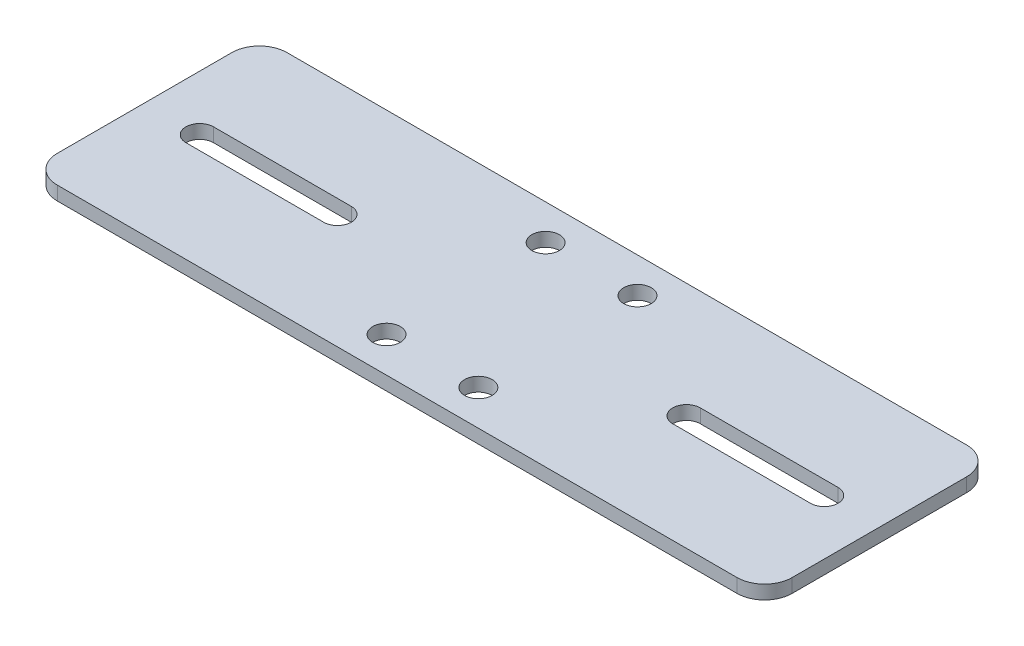
ISO-10303-21;
HEADER;
FILE_DESCRIPTION(('STEP AP214'),'2;1');
FILE_NAME('part.step','',(''),(''),'','','');
FILE_SCHEMA(('AUTOMOTIVE_DESIGN { 1 0 10303 214 1 1 1 1 }'));
ENDSEC;
DATA;
#1=APPLICATION_CONTEXT('core data for automotive mechanical design processes');
#2=APPLICATION_PROTOCOL_DEFINITION('international standard','automotive_design',2000,#1);
#3=PRODUCT_CONTEXT('',#1,'mechanical');
#4=PRODUCT('Part','Part','',(#3));
#5=PRODUCT_RELATED_PRODUCT_CATEGORY('part','',(#4));
#6=PRODUCT_DEFINITION_FORMATION('','',#4);
#7=PRODUCT_DEFINITION_CONTEXT('part definition',#1,'design');
#8=PRODUCT_DEFINITION('design','',#6,#7);
#9=PRODUCT_DEFINITION_SHAPE('','',#8);
#10=(LENGTH_UNIT() NAMED_UNIT(*) SI_UNIT(.MILLI.,.METRE.));
#11=(NAMED_UNIT(*) PLANE_ANGLE_UNIT() SI_UNIT($,.RADIAN.));
#12=(NAMED_UNIT(*) SI_UNIT($,.STERADIAN.) SOLID_ANGLE_UNIT());
#13=UNCERTAINTY_MEASURE_WITH_UNIT(LENGTH_MEASURE(1.E-05),#10,'distance_accuracy_value','');
#14=(GEOMETRIC_REPRESENTATION_CONTEXT(3) GLOBAL_UNCERTAINTY_ASSIGNED_CONTEXT((#13)) GLOBAL_UNIT_ASSIGNED_CONTEXT((#10,
#11,#12)) REPRESENTATION_CONTEXT('',''));
#15=CARTESIAN_POINT('',(0.,0.,0.));
#16=DIRECTION('',(0.,0.,1.));
#17=DIRECTION('',(1.,0.,0.));
#18=AXIS2_PLACEMENT_3D('',#15,#16,#17);
#19=CARTESIAN_POINT('',(40.0000000000001,-1.5,12.5));
#20=DIRECTION('',(1.,0.,0.));
#21=DIRECTION('',(0.,0.,-1.));
#22=AXIS2_PLACEMENT_3D('',#19,#20,#21);
#23=PLANE('',#22);
#24=DIRECTION('',(0.,0.,-1.));
#25=VECTOR('',#24,1.);
#26=CARTESIAN_POINT('',(40.0000000000001,0.,12.5));
#27=LINE('',#26,#25);
#28=CARTESIAN_POINT('',(40.0000000000001,0.,9.50000000000003));
#29=VERTEX_POINT('',#28);
#30=CARTESIAN_POINT('',(40.0000000000001,0.,-9.50000000000002));
#31=VERTEX_POINT('',#30);
#32=EDGE_CURVE('E223',#29,#31,#27,.T.);
#33=ORIENTED_EDGE('',*,*,#32,.F.);
#34=DIRECTION('',(0.,1.,0.));
#35=VECTOR('',#34,1.);
#36=CARTESIAN_POINT('',(40.0000000000001,-1.5,9.50000000000003));
#37=LINE('',#36,#35);
#38=CARTESIAN_POINT('',(40.0000000000001,-1.5,9.50000000000003));
#39=VERTEX_POINT('',#38);
#40=EDGE_CURVE('E268',#29,#39,#37,.F.);
#41=ORIENTED_EDGE('',*,*,#40,.T.);
#42=DIRECTION('',(0.,0.,-1.));
#43=VECTOR('',#42,1.);
#44=CARTESIAN_POINT('',(40.0000000000001,-1.5,12.5));
#45=LINE('',#44,#43);
#46=CARTESIAN_POINT('',(40.0000000000001,-1.5,-9.50000000000002));
#47=VERTEX_POINT('',#46);
#48=EDGE_CURVE('E230',#39,#47,#45,.T.);
#49=ORIENTED_EDGE('',*,*,#48,.T.);
#50=DIRECTION('',(0.,1.,0.));
#51=VECTOR('',#50,1.);
#52=CARTESIAN_POINT('',(40.0000000000001,-1.5,-9.50000000000002));
#53=LINE('',#52,#51);
#54=EDGE_CURVE('E265',#47,#31,#53,.T.);
#55=ORIENTED_EDGE('',*,*,#54,.T.);
#56=EDGE_LOOP('',(#33,#41,#49,#55));
#57=FACE_BOUND('',#56,.T.);
#58=ADVANCED_FACE('F36',(#57),#23,.T.);
#59=CARTESIAN_POINT('',(-40.0000000000001,-1.5,12.5));
#60=DIRECTION('',(0.,0.,1.));
#61=DIRECTION('',(1.,0.,0.));
#62=AXIS2_PLACEMENT_3D('',#59,#60,#61);
#63=PLANE('',#62);
#64=DIRECTION('',(1.,0.,0.));
#65=VECTOR('',#64,1.);
#66=CARTESIAN_POINT('',(-40.0000000000001,-1.5,12.5));
#67=LINE('',#66,#65);
#68=CARTESIAN_POINT('',(-37.0000000000001,-1.5,12.5));
#69=VERTEX_POINT('',#68);
#70=CARTESIAN_POINT('',(37.0000000000001,-1.5,12.5));
#71=VERTEX_POINT('',#70);
#72=EDGE_CURVE('E239',#69,#71,#67,.T.);
#73=ORIENTED_EDGE('',*,*,#72,.T.);
#74=DIRECTION('',(0.,1.,0.));
#75=VECTOR('',#74,1.);
#76=CARTESIAN_POINT('',(37.0000000000001,-1.5,12.5));
#77=LINE('',#76,#75);
#78=CARTESIAN_POINT('',(37.0000000000001,0.,12.5));
#79=VERTEX_POINT('',#78);
#80=EDGE_CURVE('E254',#71,#79,#77,.T.);
#81=ORIENTED_EDGE('',*,*,#80,.T.);
#82=DIRECTION('',(1.,0.,0.));
#83=VECTOR('',#82,1.);
#84=CARTESIAN_POINT('',(-40.0000000000001,0.,12.5));
#85=LINE('',#84,#83);
#86=CARTESIAN_POINT('',(-37.0000000000001,0.,12.5));
#87=VERTEX_POINT('',#86);
#88=EDGE_CURVE('E234',#87,#79,#85,.T.);
#89=ORIENTED_EDGE('',*,*,#88,.F.);
#90=DIRECTION('',(0.,1.,0.));
#91=VECTOR('',#90,1.);
#92=CARTESIAN_POINT('',(-37.0000000000001,-1.5,12.5));
#93=LINE('',#92,#91);
#94=EDGE_CURVE('E242',#87,#69,#93,.F.);
#95=ORIENTED_EDGE('',*,*,#94,.T.);
#96=EDGE_LOOP('',(#73,#81,#89,#95));
#97=FACE_BOUND('',#96,.T.);
#98=ADVANCED_FACE('F308',(#97),#63,.T.);
#99=CARTESIAN_POINT('',(-40.0000000000001,-1.5,12.5));
#100=DIRECTION('',(-1.,0.,0.));
#101=DIRECTION('',(0.,0.,1.));
#102=AXIS2_PLACEMENT_3D('',#99,#100,#101);
#103=PLANE('',#102);
#104=DIRECTION('',(0.,0.,1.));
#105=VECTOR('',#104,1.);
#106=CARTESIAN_POINT('',(-40.0000000000001,0.,12.5));
#107=LINE('',#106,#105);
#108=CARTESIAN_POINT('',(-40.0000000000001,0.,-9.50000000000002));
#109=VERTEX_POINT('',#108);
#110=CARTESIAN_POINT('',(-40.0000000000001,0.,9.50000000000003));
#111=VERTEX_POINT('',#110);
#112=EDGE_CURVE('E248',#109,#111,#107,.T.);
#113=ORIENTED_EDGE('',*,*,#112,.F.);
#114=DIRECTION('',(0.,1.,0.));
#115=VECTOR('',#114,1.);
#116=CARTESIAN_POINT('',(-40.0000000000001,-1.5,-9.50000000000002));
#117=LINE('',#116,#115);
#118=CARTESIAN_POINT('',(-40.0000000000001,-1.5,-9.50000000000002));
#119=VERTEX_POINT('',#118);
#120=EDGE_CURVE('E11',#109,#119,#117,.F.);
#121=ORIENTED_EDGE('',*,*,#120,.T.);
#122=DIRECTION('',(0.,0.,1.));
#123=VECTOR('',#122,1.);
#124=CARTESIAN_POINT('',(-40.0000000000001,-1.5,12.5));
#125=LINE('',#124,#123);
#126=CARTESIAN_POINT('',(-40.0000000000001,-1.5,9.50000000000003));
#127=VERTEX_POINT('',#126);
#128=EDGE_CURVE('E236',#119,#127,#125,.T.);
#129=ORIENTED_EDGE('',*,*,#128,.T.);
#130=DIRECTION('',(0.,1.,0.));
#131=VECTOR('',#130,1.);
#132=CARTESIAN_POINT('',(-40.0000000000001,-1.5,9.50000000000003));
#133=LINE('',#132,#131);
#134=EDGE_CURVE('E44',#127,#111,#133,.T.);
#135=ORIENTED_EDGE('',*,*,#134,.T.);
#136=EDGE_LOOP('',(#113,#121,#129,#135));
#137=FACE_BOUND('',#136,.T.);
#138=ADVANCED_FACE('F284',(#137),#103,.T.);
#139=CARTESIAN_POINT('',(-40.0000000000001,-1.5,-12.5));
#140=DIRECTION('',(0.,0.,-1.));
#141=DIRECTION('',(-1.,0.,0.));
#142=AXIS2_PLACEMENT_3D('',#139,#140,#141);
#143=PLANE('',#142);
#144=DIRECTION('',(-1.,0.,0.));
#145=VECTOR('',#144,1.);
#146=CARTESIAN_POINT('',(-40.0000000000001,0.,-12.5));
#147=LINE('',#146,#145);
#148=CARTESIAN_POINT('',(37.0000000000001,0.,-12.5));
#149=VERTEX_POINT('',#148);
#150=CARTESIAN_POINT('',(-37.0000000000001,0.,-12.5));
#151=VERTEX_POINT('',#150);
#152=EDGE_CURVE('E245',#149,#151,#147,.T.);
#153=ORIENTED_EDGE('',*,*,#152,.F.);
#154=DIRECTION('',(0.,1.,0.));
#155=VECTOR('',#154,1.);
#156=CARTESIAN_POINT('',(37.0000000000001,-1.5,-12.5));
#157=LINE('',#156,#155);
#158=CARTESIAN_POINT('',(37.0000000000001,-1.5,-12.5));
#159=VERTEX_POINT('',#158);
#160=EDGE_CURVE('E58',#149,#159,#157,.F.);
#161=ORIENTED_EDGE('',*,*,#160,.T.);
#162=DIRECTION('',(-1.,0.,0.));
#163=VECTOR('',#162,1.);
#164=CARTESIAN_POINT('',(-40.0000000000001,-1.5,-12.5));
#165=LINE('',#164,#163);
#166=CARTESIAN_POINT('',(-37.0000000000001,-1.5,-12.5));
#167=VERTEX_POINT('',#166);
#168=EDGE_CURVE('E233',#159,#167,#165,.T.);
#169=ORIENTED_EDGE('',*,*,#168,.T.);
#170=DIRECTION('',(0.,1.,0.));
#171=VECTOR('',#170,1.);
#172=CARTESIAN_POINT('',(-37.0000000000001,-1.5,-12.5));
#173=LINE('',#172,#171);
#174=EDGE_CURVE('E277',#167,#151,#173,.T.);
#175=ORIENTED_EDGE('',*,*,#174,.T.);
#176=EDGE_LOOP('',(#153,#161,#169,#175));
#177=FACE_BOUND('',#176,.T.);
#178=ADVANCED_FACE('F294',(#177),#143,.T.);
#179=CARTESIAN_POINT('',(0.,-1.5,0.));
#180=DIRECTION('',(0.,-1.,0.));
#181=DIRECTION('',(0.,0.,-1.));
#182=AXIS2_PLACEMENT_3D('',#179,#180,#181);
#183=PLANE('',#182);
#184=CARTESIAN_POINT('',(5.0000000000001,-1.5,-8.66025403784435));
#185=DIRECTION('',(0.,1.,0.));
#186=DIRECTION('',(0.,0.,1.));
#187=AXIS2_PLACEMENT_3D('',#184,#185,#186);
#188=CIRCLE('',#187,1.5);
#189=CARTESIAN_POINT('',(5.0000000000001,-1.5,-7.16025403784435));
#190=VERTEX_POINT('',#189);
#191=EDGE_CURVE('E466',#190,#190,#188,.T.);
#192=ORIENTED_EDGE('',*,*,#191,.T.);
#193=EDGE_LOOP('',(#192));
#194=FACE_BOUND('',#193,.T.);
#195=CARTESIAN_POINT('',(-4.99999999999991,-1.5,-8.66025403784446));
#196=DIRECTION('',(0.,1.,0.));
#197=DIRECTION('',(0.,0.,1.));
#198=AXIS2_PLACEMENT_3D('',#195,#196,#197);
#199=CIRCLE('',#198,1.5);
#200=CARTESIAN_POINT('',(-4.99999999999991,-1.5,-7.16025403784445));
#201=VERTEX_POINT('',#200);
#202=EDGE_CURVE('E470',#201,#201,#199,.T.);
#203=ORIENTED_EDGE('',*,*,#202,.T.);
#204=EDGE_LOOP('',(#203));
#205=FACE_BOUND('',#204,.T.);
#206=CARTESIAN_POINT('',(-5.00000000000005,-1.5,8.66025403784439));
#207=DIRECTION('',(0.,1.,0.));
#208=DIRECTION('',(0.,0.,1.));
#209=AXIS2_PLACEMENT_3D('',#206,#207,#208);
#210=CIRCLE('',#209,1.5);
#211=CARTESIAN_POINT('',(-5.00000000000005,-1.5,10.1602540378444));
#212=VERTEX_POINT('',#211);
#213=EDGE_CURVE('E474',#212,#212,#210,.T.);
#214=ORIENTED_EDGE('',*,*,#213,.T.);
#215=EDGE_LOOP('',(#214));
#216=FACE_BOUND('',#215,.T.);
#217=CARTESIAN_POINT('',(5.00000000000002,-1.5,8.66025403784442));
#218=DIRECTION('',(0.,1.,0.));
#219=DIRECTION('',(0.,0.,1.));
#220=AXIS2_PLACEMENT_3D('',#217,#218,#219);
#221=CIRCLE('',#220,1.5);
#222=CARTESIAN_POINT('',(5.00000000000002,-1.5,10.1602540378444));
#223=VERTEX_POINT('',#222);
#224=EDGE_CURVE('E188',#223,#223,#221,.T.);
#225=ORIENTED_EDGE('',*,*,#224,.T.);
#226=EDGE_LOOP('',(#225));
#227=FACE_BOUND('',#226,.T.);
#228=CARTESIAN_POINT('',(-34.0000000000001,-1.5,0.));
#229=DIRECTION('',(0.,1.,0.));
#230=DIRECTION('',(0.,0.,-1.));
#231=AXIS2_PLACEMENT_3D('',#228,#229,#230);
#232=CIRCLE('',#231,1.50000000000001);
#233=CARTESIAN_POINT('',(-34.0000000000001,-1.5,-1.50000000000001));
#234=VERTEX_POINT('',#233);
#235=CARTESIAN_POINT('',(-34.0000000000001,-1.5,1.50000000000001));
#236=VERTEX_POINT('',#235);
#237=EDGE_CURVE('E154',#234,#236,#232,.T.);
#238=ORIENTED_EDGE('',*,*,#237,.T.);
#239=DIRECTION('',(1.,0.,0.));
#240=VECTOR('',#239,1.);
#241=CARTESIAN_POINT('',(-34.0000000000001,-1.5,1.50000000000001));
#242=LINE('',#241,#240);
#243=CARTESIAN_POINT('',(-19.,-1.5,1.50000000000001));
#244=VERTEX_POINT('',#243);
#245=EDGE_CURVE('E166',#236,#244,#242,.T.);
#246=ORIENTED_EDGE('',*,*,#245,.T.);
#247=CARTESIAN_POINT('',(-19.0000000000001,-1.5,0.));
#248=DIRECTION('',(0.,1.,0.));
#249=DIRECTION('',(0.,0.,-1.));
#250=AXIS2_PLACEMENT_3D('',#247,#248,#249);
#251=CIRCLE('',#250,1.50000000000001);
#252=CARTESIAN_POINT('',(-19.0000000000001,-1.5,-1.5));
#253=VERTEX_POINT('',#252);
#254=EDGE_CURVE('E170',#244,#253,#251,.T.);
#255=ORIENTED_EDGE('',*,*,#254,.T.);
#256=DIRECTION('',(-1.,0.,0.));
#257=VECTOR('',#256,1.);
#258=CARTESIAN_POINT('',(-34.0000000000001,-1.5,-1.50000000000001));
#259=LINE('',#258,#257);
#260=EDGE_CURVE('E162',#253,#234,#259,.T.);
#261=ORIENTED_EDGE('',*,*,#260,.T.);
#262=EDGE_LOOP('',(#238,#246,#255,#261));
#263=FACE_BOUND('',#262,.T.);
#264=CARTESIAN_POINT('',(34.0000000000001,-1.5,0.));
#265=DIRECTION('',(0.,1.,0.));
#266=DIRECTION('',(0.,0.,1.));
#267=AXIS2_PLACEMENT_3D('',#264,#265,#266);
#268=CIRCLE('',#267,1.50000000000001);
#269=CARTESIAN_POINT('',(34.0000000000001,-1.5,1.50000000000001));
#270=VERTEX_POINT('',#269);
#271=CARTESIAN_POINT('',(34.0000000000001,-1.5,-1.50000000000001));
#272=VERTEX_POINT('',#271);
#273=EDGE_CURVE('E198',#270,#272,#268,.T.);
#274=ORIENTED_EDGE('',*,*,#273,.T.);
#275=DIRECTION('',(-1.,0.,0.));
#276=VECTOR('',#275,1.);
#277=CARTESIAN_POINT('',(34.0000000000001,-1.5,-1.50000000000001));
#278=LINE('',#277,#276);
#279=CARTESIAN_POINT('',(19.0000000000001,-1.5,-1.50000000000001));
#280=VERTEX_POINT('',#279);
#281=EDGE_CURVE('E201',#272,#280,#278,.T.);
#282=ORIENTED_EDGE('',*,*,#281,.T.);
#283=CARTESIAN_POINT('',(19.0000000000001,-1.5,0.));
#284=DIRECTION('',(0.,1.,0.));
#285=DIRECTION('',(0.,0.,1.));
#286=AXIS2_PLACEMENT_3D('',#283,#284,#285);
#287=CIRCLE('',#286,1.50000000000001);
#288=CARTESIAN_POINT('',(19.0000000000001,-1.5,1.5));
#289=VERTEX_POINT('',#288);
#290=EDGE_CURVE('E205',#280,#289,#287,.T.);
#291=ORIENTED_EDGE('',*,*,#290,.T.);
#292=DIRECTION('',(1.,0.,0.));
#293=VECTOR('',#292,1.);
#294=CARTESIAN_POINT('',(34.0000000000001,-1.5,1.50000000000001));
#295=LINE('',#294,#293);
#296=EDGE_CURVE('E208',#289,#270,#295,.T.);
#297=ORIENTED_EDGE('',*,*,#296,.T.);
#298=EDGE_LOOP('',(#274,#282,#291,#297));
#299=FACE_BOUND('',#298,.T.);
#300=ORIENTED_EDGE('',*,*,#48,.F.);
#301=CARTESIAN_POINT('',(37.0000000000001,-1.5,9.50000000000003));
#302=DIRECTION('',(0.,-1.,0.));
#303=DIRECTION('',(0.,0.,-1.));
#304=AXIS2_PLACEMENT_3D('',#301,#302,#303);
#305=CIRCLE('',#304,3.);
#306=EDGE_CURVE('E275',#39,#71,#305,.T.);
#307=ORIENTED_EDGE('',*,*,#306,.T.);
#308=ORIENTED_EDGE('',*,*,#72,.F.);
#309=CARTESIAN_POINT('',(-37.0000000000001,-1.5,9.50000000000003));
#310=DIRECTION('',(0.,-1.,0.));
#311=DIRECTION('',(0.,0.,-1.));
#312=AXIS2_PLACEMENT_3D('',#309,#310,#311);
#313=CIRCLE('',#312,3.);
#314=EDGE_CURVE('E270',#69,#127,#313,.T.);
#315=ORIENTED_EDGE('',*,*,#314,.T.);
#316=ORIENTED_EDGE('',*,*,#128,.F.);
#317=CARTESIAN_POINT('',(-37.0000000000001,-1.5,-9.50000000000002));
#318=DIRECTION('',(0.,-1.,0.));
#319=DIRECTION('',(0.,0.,-1.));
#320=AXIS2_PLACEMENT_3D('',#317,#318,#319);
#321=CIRCLE('',#320,3.);
#322=EDGE_CURVE('E51',#119,#167,#321,.T.);
#323=ORIENTED_EDGE('',*,*,#322,.T.);
#324=ORIENTED_EDGE('',*,*,#168,.F.);
#325=CARTESIAN_POINT('',(37.0000000000001,-1.5,-9.50000000000002));
#326=DIRECTION('',(0.,-1.,0.));
#327=DIRECTION('',(0.,0.,-1.));
#328=AXIS2_PLACEMENT_3D('',#325,#326,#327);
#329=CIRCLE('',#328,3.);
#330=EDGE_CURVE('E273',#159,#47,#329,.T.);
#331=ORIENTED_EDGE('',*,*,#330,.T.);
#332=EDGE_LOOP('',(#300,#307,#308,#315,#316,#323,#324,#331));
#333=FACE_BOUND('',#332,.T.);
#334=ADVANCED_FACE('F172',(#194,#205,#216,#227,#263,#299,#333),#183,.T.);
#335=CARTESIAN_POINT('',(0.,0.,0.));
#336=DIRECTION('',(0.,-1.,0.));
#337=DIRECTION('',(0.,0.,-1.));
#338=AXIS2_PLACEMENT_3D('',#335,#336,#337);
#339=PLANE('',#338);
#340=CARTESIAN_POINT('',(5.0000000000001,0.,-8.66025403784435));
#341=DIRECTION('',(0.,1.,0.));
#342=DIRECTION('',(0.,0.,1.));
#343=AXIS2_PLACEMENT_3D('',#340,#341,#342);
#344=CIRCLE('',#343,1.5);
#345=CARTESIAN_POINT('',(5.0000000000001,0.,-7.16025403784435));
#346=VERTEX_POINT('',#345);
#347=EDGE_CURVE('E487',#346,#346,#344,.T.);
#348=ORIENTED_EDGE('',*,*,#347,.F.);
#349=EDGE_LOOP('',(#348));
#350=FACE_BOUND('',#349,.T.);
#351=CARTESIAN_POINT('',(-4.99999999999991,0.,-8.66025403784446));
#352=DIRECTION('',(0.,1.,0.));
#353=DIRECTION('',(0.,0.,1.));
#354=AXIS2_PLACEMENT_3D('',#351,#352,#353);
#355=CIRCLE('',#354,1.5);
#356=CARTESIAN_POINT('',(-4.99999999999991,0.,-7.16025403784445));
#357=VERTEX_POINT('',#356);
#358=EDGE_CURVE('E483',#357,#357,#355,.T.);
#359=ORIENTED_EDGE('',*,*,#358,.F.);
#360=EDGE_LOOP('',(#359));
#361=FACE_BOUND('',#360,.T.);
#362=CARTESIAN_POINT('',(-5.00000000000005,0.,8.66025403784439));
#363=DIRECTION('',(0.,1.,0.));
#364=DIRECTION('',(0.,0.,1.));
#365=AXIS2_PLACEMENT_3D('',#362,#363,#364);
#366=CIRCLE('',#365,1.5);
#367=CARTESIAN_POINT('',(-5.00000000000005,0.,10.1602540378444));
#368=VERTEX_POINT('',#367);
#369=EDGE_CURVE('E479',#368,#368,#366,.T.);
#370=ORIENTED_EDGE('',*,*,#369,.F.);
#371=EDGE_LOOP('',(#370));
#372=FACE_BOUND('',#371,.T.);
#373=CARTESIAN_POINT('',(5.00000000000002,0.,8.66025403784442));
#374=DIRECTION('',(0.,1.,0.));
#375=DIRECTION('',(0.,0.,1.));
#376=AXIS2_PLACEMENT_3D('',#373,#374,#375);
#377=CIRCLE('',#376,1.5);
#378=CARTESIAN_POINT('',(5.00000000000002,0.,10.1602540378444));
#379=VERTEX_POINT('',#378);
#380=EDGE_CURVE('E181',#379,#379,#377,.T.);
#381=ORIENTED_EDGE('',*,*,#380,.F.);
#382=EDGE_LOOP('',(#381));
#383=FACE_BOUND('',#382,.T.);
#384=DIRECTION('',(1.,0.,0.));
#385=VECTOR('',#384,1.);
#386=CARTESIAN_POINT('',(-34.0000000000001,0.,1.50000000000001));
#387=LINE('',#386,#385);
#388=CARTESIAN_POINT('',(-34.0000000000001,0.,1.50000000000001));
#389=VERTEX_POINT('',#388);
#390=CARTESIAN_POINT('',(-19.,0.,1.50000000000001));
#391=VERTEX_POINT('',#390);
#392=EDGE_CURVE('E187',#389,#391,#387,.T.);
#393=ORIENTED_EDGE('',*,*,#392,.F.);
#394=CARTESIAN_POINT('',(-34.0000000000001,0.,0.));
#395=DIRECTION('',(0.,1.,0.));
#396=DIRECTION('',(0.,0.,-1.));
#397=AXIS2_PLACEMENT_3D('',#394,#395,#396);
#398=CIRCLE('',#397,1.50000000000001);
#399=CARTESIAN_POINT('',(-34.0000000000001,0.,-1.50000000000001));
#400=VERTEX_POINT('',#399);
#401=EDGE_CURVE('E157',#400,#389,#398,.T.);
#402=ORIENTED_EDGE('',*,*,#401,.F.);
#403=DIRECTION('',(-1.,0.,0.));
#404=VECTOR('',#403,1.);
#405=CARTESIAN_POINT('',(-34.0000000000001,0.,-1.50000000000001));
#406=LINE('',#405,#404);
#407=CARTESIAN_POINT('',(-19.0000000000001,0.,-1.5));
#408=VERTEX_POINT('',#407);
#409=EDGE_CURVE('E175',#408,#400,#406,.T.);
#410=ORIENTED_EDGE('',*,*,#409,.F.);
#411=CARTESIAN_POINT('',(-19.0000000000001,0.,0.));
#412=DIRECTION('',(0.,1.,0.));
#413=DIRECTION('',(0.,0.,-1.));
#414=AXIS2_PLACEMENT_3D('',#411,#412,#413);
#415=CIRCLE('',#414,1.50000000000001);
#416=EDGE_CURVE('E178',#391,#408,#415,.T.);
#417=ORIENTED_EDGE('',*,*,#416,.F.);
#418=EDGE_LOOP('',(#393,#402,#410,#417));
#419=FACE_BOUND('',#418,.T.);
#420=DIRECTION('',(-1.,0.,0.));
#421=VECTOR('',#420,1.);
#422=CARTESIAN_POINT('',(34.0000000000001,0.,-1.50000000000001));
#423=LINE('',#422,#421);
#424=CARTESIAN_POINT('',(34.0000000000001,0.,-1.50000000000001));
#425=VERTEX_POINT('',#424);
#426=CARTESIAN_POINT('',(19.0000000000001,0.,-1.50000000000001));
#427=VERTEX_POINT('',#426);
#428=EDGE_CURVE('E213',#425,#427,#423,.T.);
#429=ORIENTED_EDGE('',*,*,#428,.F.);
#430=CARTESIAN_POINT('',(34.0000000000001,0.,0.));
#431=DIRECTION('',(0.,1.,0.));
#432=DIRECTION('',(0.,0.,1.));
#433=AXIS2_PLACEMENT_3D('',#430,#431,#432);
#434=CIRCLE('',#433,1.50000000000001);
#435=CARTESIAN_POINT('',(34.0000000000001,0.,1.50000000000001));
#436=VERTEX_POINT('',#435);
#437=EDGE_CURVE('E194',#436,#425,#434,.T.);
#438=ORIENTED_EDGE('',*,*,#437,.F.);
#439=DIRECTION('',(1.,0.,0.));
#440=VECTOR('',#439,1.);
#441=CARTESIAN_POINT('',(34.0000000000001,0.,1.50000000000001));
#442=LINE('',#441,#440);
#443=CARTESIAN_POINT('',(19.0000000000001,0.,1.5));
#444=VERTEX_POINT('',#443);
#445=EDGE_CURVE('E202',#444,#436,#442,.T.);
#446=ORIENTED_EDGE('',*,*,#445,.F.);
#447=CARTESIAN_POINT('',(19.0000000000001,0.,0.));
#448=DIRECTION('',(0.,1.,0.));
#449=DIRECTION('',(0.,0.,1.));
#450=AXIS2_PLACEMENT_3D('',#447,#448,#449);
#451=CIRCLE('',#450,1.50000000000001);
#452=EDGE_CURVE('E216',#427,#444,#451,.T.);
#453=ORIENTED_EDGE('',*,*,#452,.F.);
#454=EDGE_LOOP('',(#429,#438,#446,#453));
#455=FACE_BOUND('',#454,.T.);
#456=ORIENTED_EDGE('',*,*,#88,.T.);
#457=CARTESIAN_POINT('',(37.0000000000001,0.,9.50000000000003));
#458=DIRECTION('',(0.,-1.,0.));
#459=DIRECTION('',(0.,0.,-1.));
#460=AXIS2_PLACEMENT_3D('',#457,#458,#459);
#461=CIRCLE('',#460,3.);
#462=EDGE_CURVE('E263',#79,#29,#461,.F.);
#463=ORIENTED_EDGE('',*,*,#462,.T.);
#464=ORIENTED_EDGE('',*,*,#32,.T.);
#465=CARTESIAN_POINT('',(37.0000000000001,0.,-9.50000000000002));
#466=DIRECTION('',(0.,-1.,0.));
#467=DIRECTION('',(0.,0.,-1.));
#468=AXIS2_PLACEMENT_3D('',#465,#466,#467);
#469=CIRCLE('',#468,3.);
#470=EDGE_CURVE('E261',#31,#149,#469,.F.);
#471=ORIENTED_EDGE('',*,*,#470,.T.);
#472=ORIENTED_EDGE('',*,*,#152,.T.);
#473=CARTESIAN_POINT('',(-37.0000000000001,0.,-9.50000000000002));
#474=DIRECTION('',(0.,-1.,0.));
#475=DIRECTION('',(0.,0.,-1.));
#476=AXIS2_PLACEMENT_3D('',#473,#474,#475);
#477=CIRCLE('',#476,3.);
#478=EDGE_CURVE('E259',#151,#109,#477,.F.);
#479=ORIENTED_EDGE('',*,*,#478,.T.);
#480=ORIENTED_EDGE('',*,*,#112,.T.);
#481=CARTESIAN_POINT('',(-37.0000000000001,0.,9.50000000000003));
#482=DIRECTION('',(0.,-1.,0.));
#483=DIRECTION('',(0.,0.,-1.));
#484=AXIS2_PLACEMENT_3D('',#481,#482,#483);
#485=CIRCLE('',#484,3.);
#486=EDGE_CURVE('E257',#111,#87,#485,.F.);
#487=ORIENTED_EDGE('',*,*,#486,.T.);
#488=EDGE_LOOP('',(#456,#463,#464,#471,#472,#479,#480,#487));
#489=FACE_BOUND('',#488,.T.);
#490=ADVANCED_FACE('F289',(#350,#361,#372,#383,#419,#455,#489),#339,.F.);
#491=CARTESIAN_POINT('',(34.0000000000001,-1.5,0.));
#492=DIRECTION('',(0.,1.,0.));
#493=DIRECTION('',(0.,0.,1.));
#494=AXIS2_PLACEMENT_3D('',#491,#492,#493);
#495=CYLINDRICAL_SURFACE('',#494,1.50000000000001);
#496=ORIENTED_EDGE('',*,*,#437,.T.);
#497=DIRECTION('',(0.,1.,0.));
#498=VECTOR('',#497,1.);
#499=CARTESIAN_POINT('',(34.0000000000001,-1.5,-1.50000000000001));
#500=LINE('',#499,#498);
#501=EDGE_CURVE('E211',#272,#425,#500,.T.);
#502=ORIENTED_EDGE('',*,*,#501,.F.);
#503=ORIENTED_EDGE('',*,*,#273,.F.);
#504=DIRECTION('',(0.,1.,0.));
#505=VECTOR('',#504,1.);
#506=CARTESIAN_POINT('',(34.0000000000001,-1.5,1.50000000000001));
#507=LINE('',#506,#505);
#508=EDGE_CURVE('E221',#270,#436,#507,.T.);
#509=ORIENTED_EDGE('',*,*,#508,.T.);
#510=EDGE_LOOP('',(#496,#502,#503,#509));
#511=FACE_BOUND('',#510,.T.);
#512=ADVANCED_FACE('F422',(#511),#495,.F.);
#513=CARTESIAN_POINT('',(34.0000000000001,-1.5,1.50000000000001));
#514=DIRECTION('',(0.,0.,1.));
#515=DIRECTION('',(1.,0.,0.));
#516=AXIS2_PLACEMENT_3D('',#513,#514,#515);
#517=PLANE('',#516);
#518=ORIENTED_EDGE('',*,*,#445,.T.);
#519=ORIENTED_EDGE('',*,*,#508,.F.);
#520=ORIENTED_EDGE('',*,*,#296,.F.);
#521=DIRECTION('',(0.,1.,0.));
#522=VECTOR('',#521,1.);
#523=CARTESIAN_POINT('',(19.0000000000001,-1.5,1.5));
#524=LINE('',#523,#522);
#525=EDGE_CURVE('E224',#289,#444,#524,.T.);
#526=ORIENTED_EDGE('',*,*,#525,.T.);
#527=EDGE_LOOP('',(#518,#519,#520,#526));
#528=FACE_BOUND('',#527,.T.);
#529=ADVANCED_FACE('F414',(#528),#517,.F.);
#530=CARTESIAN_POINT('',(19.0000000000001,-1.5,0.));
#531=DIRECTION('',(0.,1.,0.));
#532=DIRECTION('',(0.,0.,1.));
#533=AXIS2_PLACEMENT_3D('',#530,#531,#532);
#534=CYLINDRICAL_SURFACE('',#533,1.50000000000001);
#535=ORIENTED_EDGE('',*,*,#452,.T.);
#536=ORIENTED_EDGE('',*,*,#525,.F.);
#537=ORIENTED_EDGE('',*,*,#290,.F.);
#538=DIRECTION('',(0.,1.,0.));
#539=VECTOR('',#538,1.);
#540=CARTESIAN_POINT('',(19.0000000000001,-1.5,-1.50000000000001));
#541=LINE('',#540,#539);
#542=EDGE_CURVE('E226',#280,#427,#541,.T.);
#543=ORIENTED_EDGE('',*,*,#542,.T.);
#544=EDGE_LOOP('',(#535,#536,#537,#543));
#545=FACE_BOUND('',#544,.T.);
#546=ADVANCED_FACE('F406',(#545),#534,.F.);
#547=CARTESIAN_POINT('',(34.0000000000001,-1.5,-1.50000000000001));
#548=DIRECTION('',(0.,0.,-1.));
#549=DIRECTION('',(-1.,0.,0.));
#550=AXIS2_PLACEMENT_3D('',#547,#548,#549);
#551=PLANE('',#550);
#552=ORIENTED_EDGE('',*,*,#428,.T.);
#553=ORIENTED_EDGE('',*,*,#542,.F.);
#554=ORIENTED_EDGE('',*,*,#281,.F.);
#555=ORIENTED_EDGE('',*,*,#501,.T.);
#556=EDGE_LOOP('',(#552,#553,#554,#555));
#557=FACE_BOUND('',#556,.T.);
#558=ADVANCED_FACE('F399',(#557),#551,.F.);
#559=CARTESIAN_POINT('',(-34.0000000000001,-1.5,0.));
#560=DIRECTION('',(0.,1.,0.));
#561=DIRECTION('',(0.,0.,1.));
#562=AXIS2_PLACEMENT_3D('',#559,#560,#561);
#563=CYLINDRICAL_SURFACE('',#562,1.50000000000001);
#564=ORIENTED_EDGE('',*,*,#401,.T.);
#565=DIRECTION('',(0.,1.,0.));
#566=VECTOR('',#565,1.);
#567=CARTESIAN_POINT('',(-34.0000000000001,-1.5,1.50000000000001));
#568=LINE('',#567,#566);
#569=EDGE_CURVE('E150',#236,#389,#568,.T.);
#570=ORIENTED_EDGE('',*,*,#569,.F.);
#571=ORIENTED_EDGE('',*,*,#237,.F.);
#572=DIRECTION('',(0.,1.,0.));
#573=VECTOR('',#572,1.);
#574=CARTESIAN_POINT('',(-34.0000000000001,-1.5,-1.50000000000001));
#575=LINE('',#574,#573);
#576=EDGE_CURVE('E192',#234,#400,#575,.T.);
#577=ORIENTED_EDGE('',*,*,#576,.T.);
#578=EDGE_LOOP('',(#564,#570,#571,#577));
#579=FACE_BOUND('',#578,.T.);
#580=ADVANCED_FACE('F152',(#579),#563,.F.);
#581=CARTESIAN_POINT('',(-34.0000000000001,-1.5,-1.50000000000001));
#582=DIRECTION('',(0.,0.,-1.));
#583=DIRECTION('',(-1.,0.,0.));
#584=AXIS2_PLACEMENT_3D('',#581,#582,#583);
#585=PLANE('',#584);
#586=ORIENTED_EDGE('',*,*,#409,.T.);
#587=ORIENTED_EDGE('',*,*,#576,.F.);
#588=ORIENTED_EDGE('',*,*,#260,.F.);
#589=DIRECTION('',(0.,1.,0.));
#590=VECTOR('',#589,1.);
#591=CARTESIAN_POINT('',(-19.0000000000001,-1.5,-1.5));
#592=LINE('',#591,#590);
#593=EDGE_CURVE('E195',#253,#408,#592,.T.);
#594=ORIENTED_EDGE('',*,*,#593,.T.);
#595=EDGE_LOOP('',(#586,#587,#588,#594));
#596=FACE_BOUND('',#595,.T.);
#597=ADVANCED_FACE('F384',(#596),#585,.F.);
#598=CARTESIAN_POINT('',(-19.0000000000001,-1.5,0.));
#599=DIRECTION('',(0.,1.,0.));
#600=DIRECTION('',(0.,0.,1.));
#601=AXIS2_PLACEMENT_3D('',#598,#599,#600);
#602=CYLINDRICAL_SURFACE('',#601,1.50000000000001);
#603=ORIENTED_EDGE('',*,*,#416,.T.);
#604=ORIENTED_EDGE('',*,*,#593,.F.);
#605=ORIENTED_EDGE('',*,*,#254,.F.);
#606=DIRECTION('',(0.,1.,0.));
#607=VECTOR('',#606,1.);
#608=CARTESIAN_POINT('',(-19.,-1.5,1.50000000000001));
#609=LINE('',#608,#607);
#610=EDGE_CURVE('E161',#244,#391,#609,.T.);
#611=ORIENTED_EDGE('',*,*,#610,.T.);
#612=EDGE_LOOP('',(#603,#604,#605,#611));
#613=FACE_BOUND('',#612,.T.);
#614=ADVANCED_FACE('F377',(#613),#602,.F.);
#615=CARTESIAN_POINT('',(-34.0000000000001,-1.5,1.50000000000001));
#616=DIRECTION('',(0.,0.,1.));
#617=DIRECTION('',(1.,0.,0.));
#618=AXIS2_PLACEMENT_3D('',#615,#616,#617);
#619=PLANE('',#618);
#620=ORIENTED_EDGE('',*,*,#392,.T.);
#621=ORIENTED_EDGE('',*,*,#610,.F.);
#622=ORIENTED_EDGE('',*,*,#245,.F.);
#623=ORIENTED_EDGE('',*,*,#569,.T.);
#624=EDGE_LOOP('',(#620,#621,#622,#623));
#625=FACE_BOUND('',#624,.T.);
#626=ADVANCED_FACE('F167',(#625),#619,.F.);
#627=CARTESIAN_POINT('',(5.00000000000002,-1.5,8.66025403784442));
#628=DIRECTION('',(0.,1.,0.));
#629=DIRECTION('',(0.,0.,1.));
#630=AXIS2_PLACEMENT_3D('',#627,#628,#629);
#631=CYLINDRICAL_SURFACE('',#630,1.5);
#632=ORIENTED_EDGE('',*,*,#224,.F.);
#633=EDGE_LOOP('',(#632));
#634=FACE_BOUND('',#633,.T.);
#635=ORIENTED_EDGE('',*,*,#380,.T.);
#636=EDGE_LOOP('',(#635));
#637=FACE_BOUND('',#636,.T.);
#638=ADVANCED_FACE('F362',(#634,#637),#631,.F.);
#639=CARTESIAN_POINT('',(-5.00000000000005,-1.5,8.66025403784439));
#640=DIRECTION('',(0.,1.,0.));
#641=DIRECTION('',(0.,0.,1.));
#642=AXIS2_PLACEMENT_3D('',#639,#640,#641);
#643=CYLINDRICAL_SURFACE('',#642,1.5);
#644=ORIENTED_EDGE('',*,*,#213,.F.);
#645=EDGE_LOOP('',(#644));
#646=FACE_BOUND('',#645,.T.);
#647=ORIENTED_EDGE('',*,*,#369,.T.);
#648=EDGE_LOOP('',(#647));
#649=FACE_BOUND('',#648,.T.);
#650=ADVANCED_FACE('F354',(#646,#649),#643,.F.);
#651=CARTESIAN_POINT('',(-4.99999999999991,-1.5,-8.66025403784446));
#652=DIRECTION('',(0.,1.,0.));
#653=DIRECTION('',(0.,0.,1.));
#654=AXIS2_PLACEMENT_3D('',#651,#652,#653);
#655=CYLINDRICAL_SURFACE('',#654,1.5);
#656=ORIENTED_EDGE('',*,*,#202,.F.);
#657=EDGE_LOOP('',(#656));
#658=FACE_BOUND('',#657,.T.);
#659=ORIENTED_EDGE('',*,*,#358,.T.);
#660=EDGE_LOOP('',(#659));
#661=FACE_BOUND('',#660,.T.);
#662=ADVANCED_FACE('F346',(#658,#661),#655,.F.);
#663=CARTESIAN_POINT('',(5.0000000000001,-1.5,-8.66025403784435));
#664=DIRECTION('',(0.,1.,0.));
#665=DIRECTION('',(0.,0.,1.));
#666=AXIS2_PLACEMENT_3D('',#663,#664,#665);
#667=CYLINDRICAL_SURFACE('',#666,1.5);
#668=ORIENTED_EDGE('',*,*,#191,.F.);
#669=EDGE_LOOP('',(#668));
#670=FACE_BOUND('',#669,.T.);
#671=ORIENTED_EDGE('',*,*,#347,.T.);
#672=EDGE_LOOP('',(#671));
#673=FACE_BOUND('',#672,.T.);
#674=ADVANCED_FACE('F326',(#670,#673),#667,.F.);
#675=CARTESIAN_POINT('',(37.0000000000001,-1.5,9.50000000000003));
#676=DIRECTION('',(0.,1.,0.));
#677=DIRECTION('',(0.,0.,1.));
#678=AXIS2_PLACEMENT_3D('',#675,#676,#677);
#679=CYLINDRICAL_SURFACE('',#678,3.);
#680=ORIENTED_EDGE('',*,*,#306,.F.);
#681=ORIENTED_EDGE('',*,*,#40,.F.);
#682=ORIENTED_EDGE('',*,*,#462,.F.);
#683=ORIENTED_EDGE('',*,*,#80,.F.);
#684=EDGE_LOOP('',(#680,#681,#682,#683));
#685=FACE_BOUND('',#684,.T.);
#686=ADVANCED_FACE('F306',(#685),#679,.T.);
#687=CARTESIAN_POINT('',(37.0000000000001,-1.5,-9.50000000000002));
#688=DIRECTION('',(0.,1.,0.));
#689=DIRECTION('',(0.,0.,1.));
#690=AXIS2_PLACEMENT_3D('',#687,#688,#689);
#691=CYLINDRICAL_SURFACE('',#690,3.);
#692=ORIENTED_EDGE('',*,*,#330,.F.);
#693=ORIENTED_EDGE('',*,*,#160,.F.);
#694=ORIENTED_EDGE('',*,*,#470,.F.);
#695=ORIENTED_EDGE('',*,*,#54,.F.);
#696=EDGE_LOOP('',(#692,#693,#694,#695));
#697=FACE_BOUND('',#696,.T.);
#698=ADVANCED_FACE('F299',(#697),#691,.T.);
#699=CARTESIAN_POINT('',(-37.0000000000001,-1.5,-9.50000000000002));
#700=DIRECTION('',(0.,1.,0.));
#701=DIRECTION('',(0.,0.,1.));
#702=AXIS2_PLACEMENT_3D('',#699,#700,#701);
#703=CYLINDRICAL_SURFACE('',#702,3.);
#704=ORIENTED_EDGE('',*,*,#322,.F.);
#705=ORIENTED_EDGE('',*,*,#120,.F.);
#706=ORIENTED_EDGE('',*,*,#478,.F.);
#707=ORIENTED_EDGE('',*,*,#174,.F.);
#708=EDGE_LOOP('',(#704,#705,#706,#707));
#709=FACE_BOUND('',#708,.T.);
#710=ADVANCED_FACE('F293',(#709),#703,.T.);
#711=CARTESIAN_POINT('',(-37.0000000000001,-1.5,9.50000000000003));
#712=DIRECTION('',(0.,1.,0.));
#713=DIRECTION('',(0.,0.,1.));
#714=AXIS2_PLACEMENT_3D('',#711,#712,#713);
#715=CYLINDRICAL_SURFACE('',#714,3.);
#716=ORIENTED_EDGE('',*,*,#314,.F.);
#717=ORIENTED_EDGE('',*,*,#94,.F.);
#718=ORIENTED_EDGE('',*,*,#486,.F.);
#719=ORIENTED_EDGE('',*,*,#134,.F.);
#720=EDGE_LOOP('',(#716,#717,#718,#719));
#721=FACE_BOUND('',#720,.T.);
#722=ADVANCED_FACE('F38',(#721),#715,.T.);
#723=CLOSED_SHELL('',(#58,#98,#138,#178,#334,#490,#512,#529,#546,#558,#580,#597,#614,#626,#638,
#650,#662,#674,#686,#698,#710,#722));
#724=MANIFOLD_SOLID_BREP('B2',#723);
#725=ADVANCED_BREP_SHAPE_REPRESENTATION('',(#18,#724),#14);
#726=SHAPE_DEFINITION_REPRESENTATION(#9,#725);
ENDSEC;
END-ISO-10303-21;
